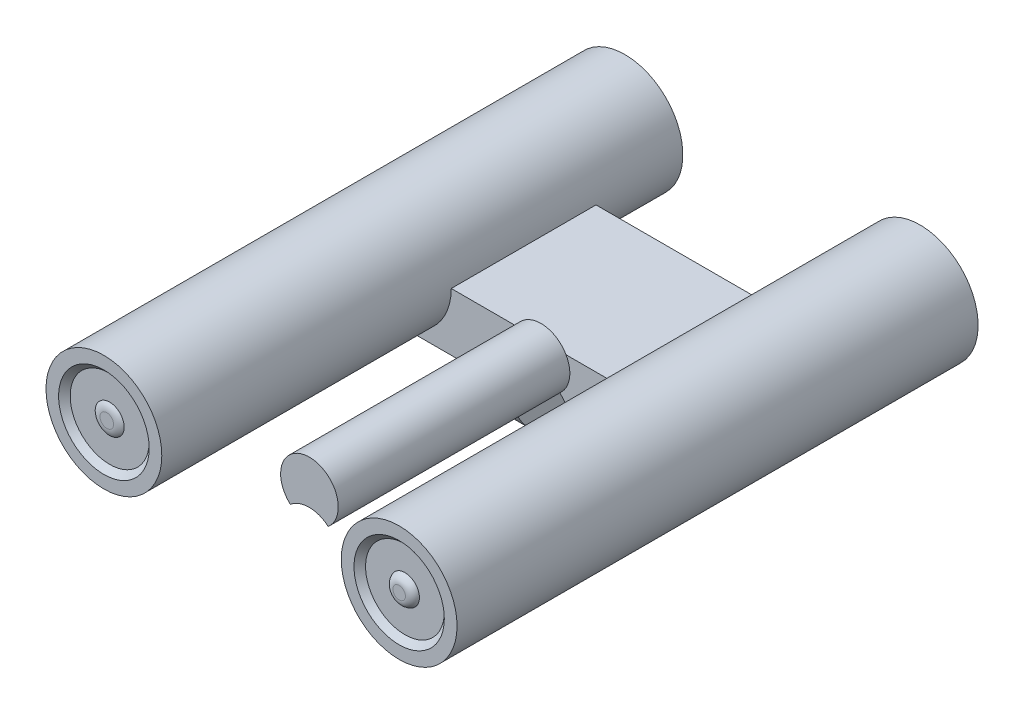
ISO-10303-21;
HEADER;
FILE_DESCRIPTION(('STEP AP214'),'2;1');
FILE_NAME('part.step','',(''),(''),'','','');
FILE_SCHEMA(('AUTOMOTIVE_DESIGN { 1 0 10303 214 1 1 1 1 }'));
ENDSEC;
DATA;
#1=APPLICATION_CONTEXT('core data for automotive mechanical design processes');
#2=APPLICATION_PROTOCOL_DEFINITION('international standard','automotive_design',2000,#1);
#3=PRODUCT_CONTEXT('',#1,'mechanical');
#4=PRODUCT('Part','Part','',(#3));
#5=PRODUCT_RELATED_PRODUCT_CATEGORY('part','',(#4));
#6=PRODUCT_DEFINITION_FORMATION('','',#4);
#7=PRODUCT_DEFINITION_CONTEXT('part definition',#1,'design');
#8=PRODUCT_DEFINITION('design','',#6,#7);
#9=PRODUCT_DEFINITION_SHAPE('','',#8);
#10=(LENGTH_UNIT() NAMED_UNIT(*) SI_UNIT(.MILLI.,.METRE.));
#11=(NAMED_UNIT(*) PLANE_ANGLE_UNIT() SI_UNIT($,.RADIAN.));
#12=(NAMED_UNIT(*) SI_UNIT($,.STERADIAN.) SOLID_ANGLE_UNIT());
#13=UNCERTAINTY_MEASURE_WITH_UNIT(LENGTH_MEASURE(1.E-05),#10,'distance_accuracy_value','');
#14=(GEOMETRIC_REPRESENTATION_CONTEXT(3) GLOBAL_UNCERTAINTY_ASSIGNED_CONTEXT((#13)) GLOBAL_UNIT_ASSIGNED_CONTEXT((#10,
#11,#12)) REPRESENTATION_CONTEXT('',''));
#15=CARTESIAN_POINT('',(0.,0.,0.));
#16=DIRECTION('',(0.,0.,1.));
#17=DIRECTION('',(1.,0.,0.));
#18=AXIS2_PLACEMENT_3D('',#15,#16,#17);
#19=CARTESIAN_POINT('',(51.,20.0045412051342,50.));
#20=DIRECTION('',(0.,0.,1.));
#21=DIRECTION('',(1.,0.,0.));
#22=AXIS2_PLACEMENT_3D('',#19,#20,#21);
#23=PLANE('',#22);
#24=CARTESIAN_POINT('',(-0.0878342514773877,0.00454120513421197,50.));
#25=DIRECTION('',(0.,0.,1.));
#26=DIRECTION('',(1.,0.,0.));
#27=AXIS2_PLACEMENT_3D('',#24,#25,#26);
#28=CIRCLE('',#27,10.);
#29=CARTESIAN_POINT('',(9.91216574852261,0.00454120513421197,50.));
#30=VERTEX_POINT('',#29);
#31=CARTESIAN_POINT('',(6.48452372863808,7.5413913815151,50.));
#32=VERTEX_POINT('',#31);
#33=EDGE_CURVE('E180',#30,#32,#28,.T.);
#34=ORIENTED_EDGE('',*,*,#33,.F.);
#35=DIRECTION('',(1.,0.,0.));
#36=VECTOR('',#35,1.);
#37=CARTESIAN_POINT('',(24.9121657485226,0.00454120513420759,50.));
#38=LINE('',#37,#36);
#39=CARTESIAN_POINT('',(24.9121657485226,0.00454120513422585,50.));
#40=VERTEX_POINT('',#39);
#41=EDGE_CURVE('E408',#30,#40,#38,.T.);
#42=ORIENTED_EDGE('',*,*,#41,.T.);
#43=DIRECTION('',(1.,0.,0.));
#44=VECTOR('',#43,1.);
#45=CARTESIAN_POINT('',(24.9121657485226,0.00454120513422585,50.));
#46=LINE('',#45,#44);
#47=CARTESIAN_POINT('',(51.,0.00454120513422585,50.));
#48=VERTEX_POINT('',#47);
#49=EDGE_CURVE('E355',#40,#48,#46,.T.);
#50=ORIENTED_EDGE('',*,*,#49,.T.);
#51=CARTESIAN_POINT('',(51.,20.0045412051342,50.));
#52=DIRECTION('',(0.,0.,1.));
#53=DIRECTION('',(1.,0.,0.));
#54=AXIS2_PLACEMENT_3D('',#51,#52,#53);
#55=CIRCLE('',#54,20.);
#56=CARTESIAN_POINT('',(31.,20.0045412051342,50.));
#57=VERTEX_POINT('',#56);
#58=EDGE_CURVE('E318',#57,#48,#55,.T.);
#59=ORIENTED_EDGE('',*,*,#58,.F.);
#60=DIRECTION('',(-1.,0.,0.));
#61=VECTOR('',#60,1.);
#62=CARTESIAN_POINT('',(-31.,20.0045412051342,50.));
#63=LINE('',#62,#61);
#64=CARTESIAN_POINT('',(8.65904755474706,20.0045412051342,50.));
#65=VERTEX_POINT('',#64);
#66=EDGE_CURVE('E346',#57,#65,#63,.T.);
#67=ORIENTED_EDGE('',*,*,#66,.T.);
#68=CARTESIAN_POINT('',(0.,15.0940631682774,50.));
#69=DIRECTION('',(0.,0.,1.));
#70=DIRECTION('',(1.,0.,0.));
#71=AXIS2_PLACEMENT_3D('',#68,#69,#70);
#72=CIRCLE('',#71,9.95449140367426);
#73=EDGE_CURVE('E71',#32,#65,#72,.T.);
#74=ORIENTED_EDGE('',*,*,#73,.F.);
#75=EDGE_LOOP('',(#34,#42,#50,#59,#67,#74));
#76=FACE_BOUND('',#75,.T.);
#77=ADVANCED_FACE('F47',(#76),#23,.T.);
#78=CARTESIAN_POINT('',(51.,20.0045412051342,0.));
#79=DIRECTION('',(0.,0.,1.));
#80=DIRECTION('',(1.,0.,0.));
#81=AXIS2_PLACEMENT_3D('',#78,#79,#80);
#82=PLANE('',#81);
#83=DIRECTION('',(1.,0.,0.));
#84=VECTOR('',#83,1.);
#85=CARTESIAN_POINT('',(51.,0.00454120513420156,0.));
#86=LINE('',#85,#84);
#87=CARTESIAN_POINT('',(24.9121657485226,0.00454120513422585,0.));
#88=VERTEX_POINT('',#87);
#89=CARTESIAN_POINT('',(9.91216574852261,0.00454120513421197,0.));
#90=VERTEX_POINT('',#89);
#91=EDGE_CURVE('E177',#88,#90,#86,.F.);
#92=ORIENTED_EDGE('',*,*,#91,.T.);
#93=CARTESIAN_POINT('',(-0.0878342514773877,0.00454120513421197,0.));
#94=DIRECTION('',(0.,0.,1.));
#95=DIRECTION('',(1.,0.,0.));
#96=AXIS2_PLACEMENT_3D('',#93,#94,#95);
#97=CIRCLE('',#96,10.);
#98=CARTESIAN_POINT('',(-10.0878342514774,0.00454120513421197,0.));
#99=VERTEX_POINT('',#98);
#100=EDGE_CURVE('E158',#90,#99,#97,.T.);
#101=ORIENTED_EDGE('',*,*,#100,.T.);
#102=DIRECTION('',(1.,0.,0.));
#103=VECTOR('',#102,1.);
#104=CARTESIAN_POINT('',(51.,0.00454120513421544,0.));
#105=LINE('',#104,#103);
#106=CARTESIAN_POINT('',(-25.0878342514774,0.00454120513421197,0.));
#107=VERTEX_POINT('',#106);
#108=EDGE_CURVE('E173',#99,#107,#105,.F.);
#109=ORIENTED_EDGE('',*,*,#108,.T.);
#110=DIRECTION('',(1.,0.,0.));
#111=VECTOR('',#110,1.);
#112=CARTESIAN_POINT('',(-51.,0.00454120513421197,0.));
#113=LINE('',#112,#111);
#114=CARTESIAN_POINT('',(-51.,0.0045412051342085,0.));
#115=VERTEX_POINT('',#114);
#116=EDGE_CURVE('E362',#115,#107,#113,.T.);
#117=ORIENTED_EDGE('',*,*,#116,.F.);
#118=CARTESIAN_POINT('',(-51.,20.0045412051342,0.));
#119=DIRECTION('',(0.,0.,-1.));
#120=DIRECTION('',(-1.,0.,0.));
#121=AXIS2_PLACEMENT_3D('',#118,#119,#120);
#122=CIRCLE('',#121,20.);
#123=CARTESIAN_POINT('',(-31.,20.0045412051342,0.));
#124=VERTEX_POINT('',#123);
#125=EDGE_CURVE('E306',#124,#115,#122,.T.);
#126=ORIENTED_EDGE('',*,*,#125,.F.);
#127=DIRECTION('',(-1.,0.,0.));
#128=VECTOR('',#127,1.);
#129=CARTESIAN_POINT('',(-31.,20.0045412051342,0.));
#130=LINE('',#129,#128);
#131=CARTESIAN_POINT('',(31.,20.0045412051342,0.));
#132=VERTEX_POINT('',#131);
#133=EDGE_CURVE('E345',#132,#124,#130,.T.);
#134=ORIENTED_EDGE('',*,*,#133,.F.);
#135=CARTESIAN_POINT('',(51.,20.0045412051342,0.));
#136=DIRECTION('',(0.,0.,1.));
#137=DIRECTION('',(1.,0.,0.));
#138=AXIS2_PLACEMENT_3D('',#135,#136,#137);
#139=CIRCLE('',#138,20.);
#140=CARTESIAN_POINT('',(51.,0.00454120513423278,0.));
#141=VERTEX_POINT('',#140);
#142=EDGE_CURVE('E227',#141,#132,#139,.F.);
#143=ORIENTED_EDGE('',*,*,#142,.F.);
#144=DIRECTION('',(1.,0.,0.));
#145=VECTOR('',#144,1.);
#146=CARTESIAN_POINT('',(24.9121657485226,0.00454120513422585,0.));
#147=LINE('',#146,#145);
#148=EDGE_CURVE('E365',#88,#141,#147,.T.);
#149=ORIENTED_EDGE('',*,*,#148,.F.);
#150=EDGE_LOOP('',(#92,#101,#109,#117,#126,#134,#143,#149));
#151=FACE_BOUND('',#150,.T.);
#152=ADVANCED_FACE('F170',(#151),#82,.F.);
#153=CARTESIAN_POINT('',(-6.57200768641268,7.61739184505086,50.));
#154=VERTEX_POINT('',#153);
#155=CARTESIAN_POINT('',(-10.0878342514774,0.00454120513421197,50.));
#156=VERTEX_POINT('',#155);
#157=EDGE_CURVE('E161',#154,#156,#28,.T.);
#158=ORIENTED_EDGE('',*,*,#157,.F.);
#159=CARTESIAN_POINT('',(-8.65904755474706,20.0045412051342,50.));
#160=VERTEX_POINT('',#159);
#161=EDGE_CURVE('E286',#160,#154,#72,.T.);
#162=ORIENTED_EDGE('',*,*,#161,.F.);
#163=CARTESIAN_POINT('',(-31.,20.0045412051342,50.));
#164=VERTEX_POINT('',#163);
#165=EDGE_CURVE('E352',#160,#164,#63,.T.);
#166=ORIENTED_EDGE('',*,*,#165,.T.);
#167=CARTESIAN_POINT('',(-51.,20.0045412051342,50.));
#168=DIRECTION('',(0.,0.,1.));
#169=DIRECTION('',(1.,0.,0.));
#170=AXIS2_PLACEMENT_3D('',#167,#168,#169);
#171=CIRCLE('',#170,20.);
#172=CARTESIAN_POINT('',(-51.,0.00454120513420156,50.));
#173=VERTEX_POINT('',#172);
#174=EDGE_CURVE('E223',#164,#173,#171,.F.);
#175=ORIENTED_EDGE('',*,*,#174,.T.);
#176=DIRECTION('',(1.,0.,0.));
#177=VECTOR('',#176,1.);
#178=CARTESIAN_POINT('',(-51.,0.00454120513421197,50.));
#179=LINE('',#178,#177);
#180=CARTESIAN_POINT('',(-25.0878342514774,0.00454120513421197,50.));
#181=VERTEX_POINT('',#180);
#182=EDGE_CURVE('E350',#173,#181,#179,.T.);
#183=ORIENTED_EDGE('',*,*,#182,.T.);
#184=DIRECTION('',(1.,0.,0.));
#185=VECTOR('',#184,1.);
#186=CARTESIAN_POINT('',(-10.0878342514774,0.00454120513421544,50.));
#187=LINE('',#186,#185);
#188=EDGE_CURVE('E191',#181,#156,#187,.T.);
#189=ORIENTED_EDGE('',*,*,#188,.T.);
#190=EDGE_LOOP('',(#158,#162,#166,#175,#183,#189));
#191=FACE_BOUND('',#190,.T.);
#192=ADVANCED_FACE('F267',(#191),#23,.T.);
#193=CARTESIAN_POINT('',(51.,20.0045412051342,50.));
#194=DIRECTION('',(0.,0.,-1.));
#195=DIRECTION('',(-1.,0.,0.));
#196=AXIS2_PLACEMENT_3D('',#193,#194,#195);
#197=CYLINDRICAL_SURFACE('',#196,20.);
#198=DIRECTION('',(0.,0.,-1.));
#199=VECTOR('',#198,1.);
#200=CARTESIAN_POINT('',(51.,0.00454120513422585,50.));
#201=LINE('',#200,#199);
#202=EDGE_CURVE('E358',#48,#141,#201,.T.);
#203=ORIENTED_EDGE('',*,*,#202,.T.);
#204=ORIENTED_EDGE('',*,*,#142,.T.);
#205=DIRECTION('',(0.,0.,-1.));
#206=VECTOR('',#205,1.);
#207=CARTESIAN_POINT('',(31.,20.0045412051342,50.));
#208=LINE('',#207,#206);
#209=EDGE_CURVE('E404',#57,#132,#208,.T.);
#210=ORIENTED_EDGE('',*,*,#209,.F.);
#211=ORIENTED_EDGE('',*,*,#58,.T.);
#212=EDGE_LOOP('',(#203,#204,#210,#211));
#213=FACE_BOUND('',#212,.T.);
#214=CARTESIAN_POINT('',(51.,20.0045412051342,150.));
#215=DIRECTION('',(0.,0.,1.));
#216=DIRECTION('',(1.,0.,0.));
#217=AXIS2_PLACEMENT_3D('',#214,#215,#216);
#218=CIRCLE('',#217,20.);
#219=CARTESIAN_POINT('',(71.,20.0045412051342,150.));
#220=VERTEX_POINT('',#219);
#221=EDGE_CURVE('E317',#220,#220,#218,.T.);
#222=ORIENTED_EDGE('',*,*,#221,.F.);
#223=EDGE_LOOP('',(#222));
#224=FACE_BOUND('',#223,.T.);
#225=CARTESIAN_POINT('',(51.,20.0045412051342,-30.));
#226=DIRECTION('',(0.,0.,-1.));
#227=DIRECTION('',(-1.,0.,0.));
#228=AXIS2_PLACEMENT_3D('',#225,#226,#227);
#229=CIRCLE('',#228,20.);
#230=CARTESIAN_POINT('',(31.,20.0045412051342,-30.));
#231=VERTEX_POINT('',#230);
#232=EDGE_CURVE('E309',#231,#231,#229,.T.);
#233=ORIENTED_EDGE('',*,*,#232,.F.);
#234=EDGE_LOOP('',(#233));
#235=FACE_BOUND('',#234,.T.);
#236=ADVANCED_FACE('F275',(#213,#224,#235),#197,.T.);
#237=CARTESIAN_POINT('',(-31.,20.0045412051342,50.));
#238=DIRECTION('',(0.,-1.,0.));
#239=DIRECTION('',(1.,0.,0.));
#240=AXIS2_PLACEMENT_3D('',#237,#238,#239);
#241=PLANE('',#240);
#242=ORIENTED_EDGE('',*,*,#133,.T.);
#243=DIRECTION('',(0.,0.,-1.));
#244=VECTOR('',#243,1.);
#245=CARTESIAN_POINT('',(-31.,20.0045412051342,50.));
#246=LINE('',#245,#244);
#247=EDGE_CURVE('E400',#164,#124,#246,.T.);
#248=ORIENTED_EDGE('',*,*,#247,.F.);
#249=ORIENTED_EDGE('',*,*,#165,.F.);
#250=EDGE_CURVE('E351',#65,#160,#63,.T.);
#251=ORIENTED_EDGE('',*,*,#250,.F.);
#252=ORIENTED_EDGE('',*,*,#66,.F.);
#253=ORIENTED_EDGE('',*,*,#209,.T.);
#254=EDGE_LOOP('',(#242,#248,#249,#251,#252,#253));
#255=FACE_BOUND('',#254,.T.);
#256=ADVANCED_FACE('F280',(#255),#241,.F.);
#257=CARTESIAN_POINT('',(-51.,20.0045412051342,50.));
#258=DIRECTION('',(0.,0.,-1.));
#259=DIRECTION('',(-1.,0.,0.));
#260=AXIS2_PLACEMENT_3D('',#257,#258,#259);
#261=CYLINDRICAL_SURFACE('',#260,20.);
#262=ORIENTED_EDGE('',*,*,#247,.T.);
#263=ORIENTED_EDGE('',*,*,#125,.T.);
#264=DIRECTION('',(0.,0.,-1.));
#265=VECTOR('',#264,1.);
#266=CARTESIAN_POINT('',(-51.,0.0045412051342085,50.));
#267=LINE('',#266,#265);
#268=EDGE_CURVE('E396',#173,#115,#267,.T.);
#269=ORIENTED_EDGE('',*,*,#268,.F.);
#270=ORIENTED_EDGE('',*,*,#174,.F.);
#271=EDGE_LOOP('',(#262,#263,#269,#270));
#272=FACE_BOUND('',#271,.T.);
#273=CARTESIAN_POINT('',(-51.,20.0045412051342,150.));
#274=DIRECTION('',(0.,0.,1.));
#275=DIRECTION('',(1.,0.,0.));
#276=AXIS2_PLACEMENT_3D('',#273,#274,#275);
#277=CIRCLE('',#276,20.);
#278=CARTESIAN_POINT('',(-31.,20.0045412051342,150.));
#279=VERTEX_POINT('',#278);
#280=EDGE_CURVE('E322',#279,#279,#277,.T.);
#281=ORIENTED_EDGE('',*,*,#280,.F.);
#282=EDGE_LOOP('',(#281));
#283=FACE_BOUND('',#282,.T.);
#284=CARTESIAN_POINT('',(-51.,20.0045412051342,-30.));
#285=DIRECTION('',(0.,0.,-1.));
#286=DIRECTION('',(-1.,0.,0.));
#287=AXIS2_PLACEMENT_3D('',#284,#285,#286);
#288=CIRCLE('',#287,20.);
#289=CARTESIAN_POINT('',(-71.,20.0045412051342,-30.));
#290=VERTEX_POINT('',#289);
#291=EDGE_CURVE('E310',#290,#290,#288,.T.);
#292=ORIENTED_EDGE('',*,*,#291,.F.);
#293=EDGE_LOOP('',(#292));
#294=FACE_BOUND('',#293,.T.);
#295=ADVANCED_FACE('F453',(#272,#283,#294),#261,.T.);
#296=CARTESIAN_POINT('',(-51.,0.00454120513421197,50.));
#297=DIRECTION('',(0.,1.,0.));
#298=DIRECTION('',(0.,0.,1.));
#299=AXIS2_PLACEMENT_3D('',#296,#297,#298);
#300=PLANE('',#299);
#301=ORIENTED_EDGE('',*,*,#116,.T.);
#302=DIRECTION('',(0.,0.,-1.));
#303=VECTOR('',#302,1.);
#304=CARTESIAN_POINT('',(-25.0878342514774,0.00454120513421197,50.));
#305=LINE('',#304,#303);
#306=EDGE_CURVE('E392',#181,#107,#305,.T.);
#307=ORIENTED_EDGE('',*,*,#306,.F.);
#308=ORIENTED_EDGE('',*,*,#182,.F.);
#309=ORIENTED_EDGE('',*,*,#268,.T.);
#310=EDGE_LOOP('',(#301,#307,#308,#309));
#311=FACE_BOUND('',#310,.T.);
#312=ADVANCED_FACE('F434',(#311),#300,.F.);
#313=CARTESIAN_POINT('',(-25.0878342514774,-19.9954587948658,50.));
#314=DIRECTION('',(1.,0.,0.));
#315=DIRECTION('',(0.,0.,-1.));
#316=AXIS2_PLACEMENT_3D('',#313,#314,#315);
#317=PLANE('',#316);
#318=CARTESIAN_POINT('',(-25.0878342514774,-9.99545879486579,25.));
#319=DIRECTION('',(1.,0.,0.));
#320=DIRECTION('',(0.,0.,-1.));
#321=AXIS2_PLACEMENT_3D('',#318,#319,#320);
#322=CIRCLE('',#321,5.);
#323=CARTESIAN_POINT('',(-25.0878342514774,-9.99545879486579,20.));
#324=VERTEX_POINT('',#323);
#325=EDGE_CURVE('E341',#324,#324,#322,.T.);
#326=ORIENTED_EDGE('',*,*,#325,.T.);
#327=EDGE_LOOP('',(#326));
#328=FACE_BOUND('',#327,.T.);
#329=DIRECTION('',(0.,0.,-1.));
#330=VECTOR('',#329,1.);
#331=CARTESIAN_POINT('',(-25.0878342514774,-19.9954587948658,50.));
#332=LINE('',#331,#330);
#333=CARTESIAN_POINT('',(-25.0878342514774,-19.9954587948658,30.));
#334=VERTEX_POINT('',#333);
#335=CARTESIAN_POINT('',(-25.0878342514774,-19.9954587948658,20.));
#336=VERTEX_POINT('',#335);
#337=EDGE_CURVE('E388',#334,#336,#332,.T.);
#338=ORIENTED_EDGE('',*,*,#337,.F.);
#339=CARTESIAN_POINT('',(-25.0878342514774,0.00454120513421544,30.));
#340=DIRECTION('',(1.,0.,0.));
#341=DIRECTION('',(0.,0.,-1.));
#342=AXIS2_PLACEMENT_3D('',#339,#340,#341);
#343=CIRCLE('',#342,20.);
#344=EDGE_CURVE('E203',#334,#181,#343,.F.);
#345=ORIENTED_EDGE('',*,*,#344,.T.);
#346=ORIENTED_EDGE('',*,*,#306,.T.);
#347=CARTESIAN_POINT('',(-25.0878342514774,0.00454120513421544,20.));
#348=DIRECTION('',(1.,0.,0.));
#349=DIRECTION('',(0.,0.,-1.));
#350=AXIS2_PLACEMENT_3D('',#347,#348,#349);
#351=CIRCLE('',#350,20.);
#352=EDGE_CURVE('E195',#107,#336,#351,.F.);
#353=ORIENTED_EDGE('',*,*,#352,.T.);
#354=EDGE_LOOP('',(#338,#345,#346,#353));
#355=FACE_BOUND('',#354,.T.);
#356=ADVANCED_FACE('F427',(#328,#355),#317,.F.);
#357=CARTESIAN_POINT('',(-25.0878342514774,-19.9954587948658,50.));
#358=DIRECTION('',(0.,1.,0.));
#359=DIRECTION('',(0.,0.,1.));
#360=AXIS2_PLACEMENT_3D('',#357,#358,#359);
#361=PLANE('',#360);
#362=DIRECTION('',(0.,0.,-1.));
#363=VECTOR('',#362,1.);
#364=CARTESIAN_POINT('',(-10.0878342514774,-19.9954587948658,50.));
#365=LINE('',#364,#363);
#366=CARTESIAN_POINT('',(-10.0878342514774,-19.9954587948658,30.));
#367=VERTEX_POINT('',#366);
#368=CARTESIAN_POINT('',(-10.0878342514774,-19.9954587948658,20.));
#369=VERTEX_POINT('',#368);
#370=EDGE_CURVE('E166',#367,#369,#365,.T.);
#371=ORIENTED_EDGE('',*,*,#370,.F.);
#372=DIRECTION('',(1.,0.,0.));
#373=VECTOR('',#372,1.);
#374=CARTESIAN_POINT('',(-25.0878342514774,-19.9954587948658,30.));
#375=LINE('',#374,#373);
#376=EDGE_CURVE('E419',#367,#334,#375,.F.);
#377=ORIENTED_EDGE('',*,*,#376,.T.);
#378=ORIENTED_EDGE('',*,*,#337,.T.);
#379=DIRECTION('',(1.,0.,0.));
#380=VECTOR('',#379,1.);
#381=CARTESIAN_POINT('',(-25.0878342514774,-19.9954587948658,20.));
#382=LINE('',#381,#380);
#383=EDGE_CURVE('E416',#336,#369,#382,.T.);
#384=ORIENTED_EDGE('',*,*,#383,.T.);
#385=EDGE_LOOP('',(#371,#377,#378,#384));
#386=FACE_BOUND('',#385,.T.);
#387=ADVANCED_FACE('F437',(#386),#361,.F.);
#388=CARTESIAN_POINT('',(-10.0878342514774,-19.9954587948658,50.));
#389=DIRECTION('',(-1.,0.,0.));
#390=DIRECTION('',(0.,0.,1.));
#391=AXIS2_PLACEMENT_3D('',#388,#389,#390);
#392=PLANE('',#391);
#393=CARTESIAN_POINT('',(-10.0878342514774,-9.99545879486579,25.));
#394=DIRECTION('',(-1.,0.,0.));
#395=DIRECTION('',(0.,0.,1.));
#396=AXIS2_PLACEMENT_3D('',#393,#394,#395);
#397=CIRCLE('',#396,5.);
#398=CARTESIAN_POINT('',(-10.0878342514774,-9.99545879486579,30.));
#399=VERTEX_POINT('',#398);
#400=EDGE_CURVE('E337',#399,#399,#397,.T.);
#401=ORIENTED_EDGE('',*,*,#400,.T.);
#402=EDGE_LOOP('',(#401));
#403=FACE_BOUND('',#402,.T.);
#404=DIRECTION('',(0.,0.,-1.));
#405=VECTOR('',#404,1.);
#406=CARTESIAN_POINT('',(-10.0878342514774,0.00454120513421544,50.));
#407=LINE('',#406,#405);
#408=EDGE_CURVE('E155',#156,#99,#407,.T.);
#409=ORIENTED_EDGE('',*,*,#408,.F.);
#410=CARTESIAN_POINT('',(-10.0878342514774,0.00454120513421544,30.));
#411=DIRECTION('',(-1.,0.,0.));
#412=DIRECTION('',(0.,0.,1.));
#413=AXIS2_PLACEMENT_3D('',#410,#411,#412);
#414=CIRCLE('',#413,20.);
#415=EDGE_CURVE('E190',#156,#367,#414,.F.);
#416=ORIENTED_EDGE('',*,*,#415,.T.);
#417=ORIENTED_EDGE('',*,*,#370,.T.);
#418=CARTESIAN_POINT('',(-10.0878342514774,0.00454120513421544,20.));
#419=DIRECTION('',(-1.,0.,0.));
#420=DIRECTION('',(0.,0.,1.));
#421=AXIS2_PLACEMENT_3D('',#418,#419,#420);
#422=CIRCLE('',#421,20.);
#423=EDGE_CURVE('E183',#369,#99,#422,.F.);
#424=ORIENTED_EDGE('',*,*,#423,.T.);
#425=EDGE_LOOP('',(#409,#416,#417,#424));
#426=FACE_BOUND('',#425,.T.);
#427=ADVANCED_FACE('F184',(#403,#426),#392,.F.);
#428=CARTESIAN_POINT('',(9.91216574852261,0.00454120513421544,50.));
#429=DIRECTION('',(1.,0.,0.));
#430=DIRECTION('',(0.,1.,0.));
#431=AXIS2_PLACEMENT_3D('',#428,#429,#430);
#432=PLANE('',#431);
#433=CARTESIAN_POINT('',(9.91216574852261,-9.99545879486579,25.));
#434=DIRECTION('',(1.,0.,0.));
#435=DIRECTION('',(0.,1.,0.));
#436=AXIS2_PLACEMENT_3D('',#433,#434,#435);
#437=CIRCLE('',#436,5.);
#438=CARTESIAN_POINT('',(9.91216574852261,-4.99545879486579,25.));
#439=VERTEX_POINT('',#438);
#440=EDGE_CURVE('E333',#439,#439,#437,.T.);
#441=ORIENTED_EDGE('',*,*,#440,.T.);
#442=EDGE_LOOP('',(#441));
#443=FACE_BOUND('',#442,.T.);
#444=DIRECTION('',(0.,0.,-1.));
#445=VECTOR('',#444,1.);
#446=CARTESIAN_POINT('',(9.91216574852261,0.00454120513421544,50.));
#447=LINE('',#446,#445);
#448=EDGE_CURVE('E167',#30,#90,#447,.T.);
#449=ORIENTED_EDGE('',*,*,#448,.T.);
#450=CARTESIAN_POINT('',(9.91216574852261,0.00454120513421197,20.));
#451=DIRECTION('',(1.,0.,0.));
#452=DIRECTION('',(0.,1.,0.));
#453=AXIS2_PLACEMENT_3D('',#450,#451,#452);
#454=CIRCLE('',#453,20.);
#455=CARTESIAN_POINT('',(9.91216574852261,-19.9954587948658,20.));
#456=VERTEX_POINT('',#455);
#457=EDGE_CURVE('E220',#90,#456,#454,.F.);
#458=ORIENTED_EDGE('',*,*,#457,.T.);
#459=DIRECTION('',(0.,0.,-1.));
#460=VECTOR('',#459,1.);
#461=CARTESIAN_POINT('',(9.91216574852261,-19.9954587948658,50.));
#462=LINE('',#461,#460);
#463=CARTESIAN_POINT('',(9.91216574852261,-19.9954587948658,30.));
#464=VERTEX_POINT('',#463);
#465=EDGE_CURVE('E380',#464,#456,#462,.T.);
#466=ORIENTED_EDGE('',*,*,#465,.F.);
#467=CARTESIAN_POINT('',(9.91216574852261,0.00454120513421106,30.));
#468=DIRECTION('',(1.,0.,0.));
#469=DIRECTION('',(0.,1.,0.));
#470=AXIS2_PLACEMENT_3D('',#467,#468,#469);
#471=CIRCLE('',#470,20.);
#472=EDGE_CURVE('E216',#464,#30,#471,.F.);
#473=ORIENTED_EDGE('',*,*,#472,.T.);
#474=EDGE_LOOP('',(#449,#458,#466,#473));
#475=FACE_BOUND('',#474,.T.);
#476=ADVANCED_FACE('F444',(#443,#475),#432,.F.);
#477=CARTESIAN_POINT('',(9.91216574852261,-19.9954587948658,50.));
#478=DIRECTION('',(0.,1.,0.));
#479=DIRECTION('',(-1.,0.,0.));
#480=AXIS2_PLACEMENT_3D('',#477,#478,#479);
#481=PLANE('',#480);
#482=ORIENTED_EDGE('',*,*,#465,.T.);
#483=DIRECTION('',(1.,0.,0.));
#484=VECTOR('',#483,1.);
#485=CARTESIAN_POINT('',(9.91216574852261,-19.9954587948658,20.));
#486=LINE('',#485,#484);
#487=CARTESIAN_POINT('',(24.9121657485226,-19.9954587948658,20.));
#488=VERTEX_POINT('',#487);
#489=EDGE_CURVE('E201',#456,#488,#486,.T.);
#490=ORIENTED_EDGE('',*,*,#489,.T.);
#491=DIRECTION('',(0.,0.,-1.));
#492=VECTOR('',#491,1.);
#493=CARTESIAN_POINT('',(24.9121657485226,-19.9954587948658,50.));
#494=LINE('',#493,#492);
#495=CARTESIAN_POINT('',(24.9121657485226,-19.9954587948658,30.));
#496=VERTEX_POINT('',#495);
#497=EDGE_CURVE('E376',#496,#488,#494,.T.);
#498=ORIENTED_EDGE('',*,*,#497,.F.);
#499=DIRECTION('',(1.,0.,0.));
#500=VECTOR('',#499,1.);
#501=CARTESIAN_POINT('',(9.91216574852261,-19.9954587948658,30.));
#502=LINE('',#501,#500);
#503=EDGE_CURVE('E197',#496,#464,#502,.F.);
#504=ORIENTED_EDGE('',*,*,#503,.T.);
#505=EDGE_LOOP('',(#482,#490,#498,#504));
#506=FACE_BOUND('',#505,.T.);
#507=ADVANCED_FACE('F526',(#506),#481,.F.);
#508=CARTESIAN_POINT('',(24.9121657485226,-19.9954587948658,50.));
#509=DIRECTION('',(-1.,0.,0.));
#510=DIRECTION('',(0.,0.,1.));
#511=AXIS2_PLACEMENT_3D('',#508,#509,#510);
#512=PLANE('',#511);
#513=CARTESIAN_POINT('',(24.9121657485226,-9.99545879486579,25.));
#514=DIRECTION('',(1.,0.,0.));
#515=DIRECTION('',(0.,0.,-1.));
#516=AXIS2_PLACEMENT_3D('',#513,#514,#515);
#517=CIRCLE('',#516,5.);
#518=CARTESIAN_POINT('',(24.9121657485226,-9.99545879486579,20.));
#519=VERTEX_POINT('',#518);
#520=EDGE_CURVE('E329',#519,#519,#517,.T.);
#521=ORIENTED_EDGE('',*,*,#520,.F.);
#522=EDGE_LOOP('',(#521));
#523=FACE_BOUND('',#522,.T.);
#524=ORIENTED_EDGE('',*,*,#497,.T.);
#525=CARTESIAN_POINT('',(24.9121657485226,0.0045412051342085,20.));
#526=DIRECTION('',(-1.,0.,0.));
#527=DIRECTION('',(0.,0.,1.));
#528=AXIS2_PLACEMENT_3D('',#525,#526,#527);
#529=CIRCLE('',#528,20.);
#530=EDGE_CURVE('E213',#488,#88,#529,.F.);
#531=ORIENTED_EDGE('',*,*,#530,.T.);
#532=DIRECTION('',(0.,0.,-1.));
#533=VECTOR('',#532,1.);
#534=CARTESIAN_POINT('',(24.9121657485226,0.00454120513422585,50.));
#535=LINE('',#534,#533);
#536=EDGE_CURVE('E372',#40,#88,#535,.T.);
#537=ORIENTED_EDGE('',*,*,#536,.F.);
#538=CARTESIAN_POINT('',(24.9121657485226,0.00454120513420759,30.));
#539=DIRECTION('',(-1.,0.,0.));
#540=DIRECTION('',(0.,0.,1.));
#541=AXIS2_PLACEMENT_3D('',#538,#539,#540);
#542=CIRCLE('',#541,20.);
#543=EDGE_CURVE('E210',#40,#496,#542,.F.);
#544=ORIENTED_EDGE('',*,*,#543,.T.);
#545=EDGE_LOOP('',(#524,#531,#537,#544));
#546=FACE_BOUND('',#545,.T.);
#547=ADVANCED_FACE('F531',(#523,#546),#512,.F.);
#548=CARTESIAN_POINT('',(24.9121657485226,0.00454120513422585,50.));
#549=DIRECTION('',(0.,1.,0.));
#550=DIRECTION('',(0.,0.,1.));
#551=AXIS2_PLACEMENT_3D('',#548,#549,#550);
#552=PLANE('',#551);
#553=ORIENTED_EDGE('',*,*,#148,.T.);
#554=ORIENTED_EDGE('',*,*,#202,.F.);
#555=ORIENTED_EDGE('',*,*,#49,.F.);
#556=ORIENTED_EDGE('',*,*,#536,.T.);
#557=EDGE_LOOP('',(#553,#554,#555,#556));
#558=FACE_BOUND('',#557,.T.);
#559=ADVANCED_FACE('F518',(#558),#552,.F.);
#560=CARTESIAN_POINT('',(-71.,-9.99545879486579,25.));
#561=DIRECTION('',(1.,0.,0.));
#562=DIRECTION('',(0.,0.,-1.));
#563=AXIS2_PLACEMENT_3D('',#560,#561,#562);
#564=CYLINDRICAL_SURFACE('',#563,5.);
#565=ORIENTED_EDGE('',*,*,#520,.T.);
#566=EDGE_LOOP('',(#565));
#567=FACE_BOUND('',#566,.T.);
#568=ORIENTED_EDGE('',*,*,#440,.F.);
#569=EDGE_LOOP('',(#568));
#570=FACE_BOUND('',#569,.T.);
#571=ADVANCED_FACE('F539',(#567,#570),#564,.F.);
#572=ORIENTED_EDGE('',*,*,#400,.F.);
#573=EDGE_LOOP('',(#572));
#574=FACE_BOUND('',#573,.T.);
#575=ORIENTED_EDGE('',*,*,#325,.F.);
#576=EDGE_LOOP('',(#575));
#577=FACE_BOUND('',#576,.T.);
#578=ADVANCED_FACE('F462',(#574,#577),#564,.F.);
#579=CARTESIAN_POINT('',(51.,0.00454120513421544,30.));
#580=DIRECTION('',(-1.,0.,0.));
#581=DIRECTION('',(0.,0.,1.));
#582=AXIS2_PLACEMENT_3D('',#579,#580,#581);
#583=CYLINDRICAL_SURFACE('',#582,20.);
#584=ORIENTED_EDGE('',*,*,#344,.F.);
#585=ORIENTED_EDGE('',*,*,#376,.F.);
#586=ORIENTED_EDGE('',*,*,#415,.F.);
#587=ORIENTED_EDGE('',*,*,#188,.F.);
#588=EDGE_LOOP('',(#584,#585,#586,#587));
#589=FACE_BOUND('',#588,.T.);
#590=ADVANCED_FACE('F435',(#589),#583,.T.);
#591=CARTESIAN_POINT('',(-25.0878342514774,0.00454120513421544,20.));
#592=DIRECTION('',(1.,0.,0.));
#593=DIRECTION('',(0.,0.,-1.));
#594=AXIS2_PLACEMENT_3D('',#591,#592,#593);
#595=CYLINDRICAL_SURFACE('',#594,20.);
#596=ORIENTED_EDGE('',*,*,#352,.F.);
#597=ORIENTED_EDGE('',*,*,#108,.F.);
#598=ORIENTED_EDGE('',*,*,#423,.F.);
#599=ORIENTED_EDGE('',*,*,#383,.F.);
#600=EDGE_LOOP('',(#596,#597,#598,#599));
#601=FACE_BOUND('',#600,.T.);
#602=ADVANCED_FACE('F194',(#601),#595,.T.);
#603=CARTESIAN_POINT('',(9.91216574852262,0.00454120513421197,20.));
#604=DIRECTION('',(1.,0.,0.));
#605=DIRECTION('',(0.,1.,0.));
#606=AXIS2_PLACEMENT_3D('',#603,#604,#605);
#607=CYLINDRICAL_SURFACE('',#606,20.);
#608=ORIENTED_EDGE('',*,*,#457,.F.);
#609=ORIENTED_EDGE('',*,*,#91,.F.);
#610=ORIENTED_EDGE('',*,*,#530,.F.);
#611=ORIENTED_EDGE('',*,*,#489,.F.);
#612=EDGE_LOOP('',(#608,#609,#610,#611));
#613=FACE_BOUND('',#612,.T.);
#614=ADVANCED_FACE('F465',(#613),#607,.T.);
#615=CARTESIAN_POINT('',(51.,0.00454120513420156,30.));
#616=DIRECTION('',(-1.,0.,0.));
#617=DIRECTION('',(0.,-1.,0.));
#618=AXIS2_PLACEMENT_3D('',#615,#616,#617);
#619=CYLINDRICAL_SURFACE('',#618,20.);
#620=ORIENTED_EDGE('',*,*,#472,.F.);
#621=ORIENTED_EDGE('',*,*,#503,.F.);
#622=ORIENTED_EDGE('',*,*,#543,.F.);
#623=ORIENTED_EDGE('',*,*,#41,.F.);
#624=EDGE_LOOP('',(#620,#621,#622,#623));
#625=FACE_BOUND('',#624,.T.);
#626=ADVANCED_FACE('F468',(#625),#619,.T.);
#627=CARTESIAN_POINT('',(-51.,20.0045412051342,150.));
#628=DIRECTION('',(0.,0.,1.));
#629=DIRECTION('',(1.,0.,0.));
#630=AXIS2_PLACEMENT_3D('',#627,#628,#629);
#631=PLANE('',#630);
#632=CARTESIAN_POINT('',(-51.,20.0045412051342,150.));
#633=DIRECTION('',(0.,0.,1.));
#634=DIRECTION('',(1.,0.,0.));
#635=AXIS2_PLACEMENT_3D('',#632,#633,#634);
#636=CIRCLE('',#635,15.6438362550542);
#637=CARTESIAN_POINT('',(-35.3561637449458,20.0045412051342,150.));
#638=VERTEX_POINT('',#637);
#639=EDGE_CURVE('E233',#638,#638,#636,.F.);
#640=ORIENTED_EDGE('',*,*,#639,.T.);
#641=EDGE_LOOP('',(#640));
#642=FACE_BOUND('',#641,.T.);
#643=ORIENTED_EDGE('',*,*,#280,.T.);
#644=EDGE_LOOP('',(#643));
#645=FACE_BOUND('',#644,.T.);
#646=ADVANCED_FACE('F472',(#642,#645),#631,.T.);
#647=CARTESIAN_POINT('',(51.,20.0045412051342,150.));
#648=DIRECTION('',(0.,0.,1.));
#649=DIRECTION('',(1.,0.,0.));
#650=AXIS2_PLACEMENT_3D('',#647,#648,#649);
#651=PLANE('',#650);
#652=CARTESIAN_POINT('',(51.,20.0045412051342,150.));
#653=DIRECTION('',(0.,0.,1.));
#654=DIRECTION('',(1.,0.,0.));
#655=AXIS2_PLACEMENT_3D('',#652,#653,#654);
#656=CIRCLE('',#655,15.6000000000001);
#657=CARTESIAN_POINT('',(66.6000000000001,20.0045412051342,150.));
#658=VERTEX_POINT('',#657);
#659=EDGE_CURVE('E11',#658,#658,#656,.F.);
#660=ORIENTED_EDGE('',*,*,#659,.T.);
#661=EDGE_LOOP('',(#660));
#662=FACE_BOUND('',#661,.T.);
#663=ORIENTED_EDGE('',*,*,#221,.T.);
#664=EDGE_LOOP('',(#663));
#665=FACE_BOUND('',#664,.T.);
#666=ADVANCED_FACE('F558',(#662,#665),#651,.T.);
#667=CARTESIAN_POINT('',(51.,20.0045412051342,-30.));
#668=DIRECTION('',(0.,0.,-1.));
#669=DIRECTION('',(-1.,0.,0.));
#670=AXIS2_PLACEMENT_3D('',#667,#668,#669);
#671=PLANE('',#670);
#672=ORIENTED_EDGE('',*,*,#232,.T.);
#673=EDGE_LOOP('',(#672));
#674=FACE_BOUND('',#673,.T.);
#675=ADVANCED_FACE('F562',(#674),#671,.T.);
#676=CARTESIAN_POINT('',(-51.,20.0045412051342,-30.));
#677=DIRECTION('',(0.,0.,-1.));
#678=DIRECTION('',(-1.,0.,0.));
#679=AXIS2_PLACEMENT_3D('',#676,#677,#678);
#680=PLANE('',#679);
#681=ORIENTED_EDGE('',*,*,#291,.T.);
#682=EDGE_LOOP('',(#681));
#683=FACE_BOUND('',#682,.T.);
#684=ADVANCED_FACE('F566',(#683),#680,.T.);
#685=CARTESIAN_POINT('',(0.,15.0940631682774,50.));
#686=DIRECTION('',(0.,0.,1.));
#687=DIRECTION('',(1.,0.,0.));
#688=AXIS2_PLACEMENT_3D('',#685,#686,#687);
#689=PLANE('',#688);
#690=EDGE_CURVE('E298',#65,#160,#72,.T.);
#691=ORIENTED_EDGE('',*,*,#690,.F.);
#692=ORIENTED_EDGE('',*,*,#250,.T.);
#693=EDGE_LOOP('',(#691,#692));
#694=FACE_BOUND('',#693,.T.);
#695=ADVANCED_FACE('F508',(#694),#689,.F.);
#696=CARTESIAN_POINT('',(0.,15.0940631682774,130.));
#697=DIRECTION('',(0.,0.,-1.));
#698=DIRECTION('',(-1.,0.,0.));
#699=AXIS2_PLACEMENT_3D('',#696,#697,#698);
#700=CYLINDRICAL_SURFACE('',#699,9.95449140367426);
#701=ORIENTED_EDGE('',*,*,#161,.T.);
#702=DIRECTION('',(0.,0.,1.));
#703=VECTOR('',#702,1.);
#704=CARTESIAN_POINT('',(-6.57200768641269,7.61739184505086,60.));
#705=LINE('',#704,#703);
#706=CARTESIAN_POINT('',(-6.57200768641269,7.61739184505086,130.));
#707=VERTEX_POINT('',#706);
#708=EDGE_CURVE('E291',#154,#707,#705,.T.);
#709=ORIENTED_EDGE('',*,*,#708,.T.);
#710=CARTESIAN_POINT('',(0.,15.0940631682774,130.));
#711=DIRECTION('',(0.,0.,1.));
#712=DIRECTION('',(1.,0.,0.));
#713=AXIS2_PLACEMENT_3D('',#710,#711,#712);
#714=CIRCLE('',#713,9.95449140367426);
#715=CARTESIAN_POINT('',(6.48452372863808,7.5413913815151,130.));
#716=VERTEX_POINT('',#715);
#717=EDGE_CURVE('E303',#716,#707,#714,.T.);
#718=ORIENTED_EDGE('',*,*,#717,.F.);
#719=DIRECTION('',(0.,0.,1.));
#720=VECTOR('',#719,1.);
#721=CARTESIAN_POINT('',(6.48452372863808,7.5413913815151,60.));
#722=LINE('',#721,#720);
#723=EDGE_CURVE('E64',#716,#32,#722,.F.);
#724=ORIENTED_EDGE('',*,*,#723,.T.);
#725=ORIENTED_EDGE('',*,*,#73,.T.);
#726=ORIENTED_EDGE('',*,*,#690,.T.);
#727=EDGE_LOOP('',(#701,#709,#718,#724,#725,#726));
#728=FACE_BOUND('',#727,.T.);
#729=ADVANCED_FACE('F294',(#728),#700,.T.);
#730=CARTESIAN_POINT('',(0.,15.0940631682774,130.));
#731=DIRECTION('',(0.,0.,1.));
#732=DIRECTION('',(1.,0.,0.));
#733=AXIS2_PLACEMENT_3D('',#730,#731,#732);
#734=PLANE('',#733);
#735=CARTESIAN_POINT('',(-0.0878342514773877,0.00454120513421197,130.));
#736=DIRECTION('',(0.,0.,1.));
#737=DIRECTION('',(1.,0.,0.));
#738=AXIS2_PLACEMENT_3D('',#735,#736,#737);
#739=CIRCLE('',#738,10.);
#740=EDGE_CURVE('E230',#716,#707,#739,.T.);
#741=ORIENTED_EDGE('',*,*,#740,.F.);
#742=ORIENTED_EDGE('',*,*,#717,.T.);
#743=EDGE_LOOP('',(#741,#742));
#744=FACE_BOUND('',#743,.T.);
#745=ADVANCED_FACE('F573',(#744),#734,.T.);
#746=CARTESIAN_POINT('',(-0.0878342514773877,0.00454120513421197,-30.));
#747=DIRECTION('',(0.,0.,1.));
#748=DIRECTION('',(1.,0.,0.));
#749=AXIS2_PLACEMENT_3D('',#746,#747,#748);
#750=CYLINDRICAL_SURFACE('',#749,10.);
#751=ORIENTED_EDGE('',*,*,#448,.F.);
#752=ORIENTED_EDGE('',*,*,#33,.T.);
#753=ORIENTED_EDGE('',*,*,#723,.F.);
#754=ORIENTED_EDGE('',*,*,#740,.T.);
#755=ORIENTED_EDGE('',*,*,#708,.F.);
#756=ORIENTED_EDGE('',*,*,#157,.T.);
#757=ORIENTED_EDGE('',*,*,#408,.T.);
#758=ORIENTED_EDGE('',*,*,#100,.F.);
#759=EDGE_LOOP('',(#751,#752,#753,#754,#755,#756,#757,#758));
#760=FACE_BOUND('',#759,.T.);
#761=ADVANCED_FACE('F157',(#760),#750,.F.);
#762=CARTESIAN_POINT('',(-51.,20.0045412051342,148.));
#763=DIRECTION('',(0.,0.,1.));
#764=DIRECTION('',(1.,0.,0.));
#765=AXIS2_PLACEMENT_3D('',#762,#763,#764);
#766=PLANE('',#765);
#767=CARTESIAN_POINT('',(-51.,20.0045412051342,148.));
#768=DIRECTION('',(0.,0.,1.));
#769=DIRECTION('',(1.,0.,0.));
#770=AXIS2_PLACEMENT_3D('',#767,#768,#769);
#771=CIRCLE('',#770,5.);
#772=CARTESIAN_POINT('',(-46.,20.0045412051342,148.));
#773=VERTEX_POINT('',#772);
#774=EDGE_CURVE('E234',#773,#773,#771,.F.);
#775=ORIENTED_EDGE('',*,*,#774,.T.);
#776=EDGE_LOOP('',(#775));
#777=FACE_BOUND('',#776,.T.);
#778=CARTESIAN_POINT('',(-51.,20.0045412051342,148.));
#779=DIRECTION('',(0.,0.,1.));
#780=DIRECTION('',(1.,0.,0.));
#781=AXIS2_PLACEMENT_3D('',#778,#779,#780);
#782=CIRCLE('',#781,13.6438362550542);
#783=CARTESIAN_POINT('',(-37.3561637449458,20.0045412051342,148.));
#784=VERTEX_POINT('',#783);
#785=EDGE_CURVE('E238',#784,#784,#782,.T.);
#786=ORIENTED_EDGE('',*,*,#785,.T.);
#787=EDGE_LOOP('',(#786));
#788=FACE_BOUND('',#787,.T.);
#789=ADVANCED_FACE('F488',(#777,#788),#766,.T.);
#790=CARTESIAN_POINT('',(-51.,20.0045412051342,149.));
#791=DIRECTION('',(0.,0.,1.));
#792=DIRECTION('',(1.,0.,0.));
#793=AXIS2_PLACEMENT_3D('',#790,#791,#792);
#794=PLANE('',#793);
#795=CARTESIAN_POINT('',(-51.,20.0045412051342,149.));
#796=DIRECTION('',(0.,0.,1.));
#797=DIRECTION('',(1.,0.,0.));
#798=AXIS2_PLACEMENT_3D('',#795,#796,#797);
#799=CIRCLE('',#798,2.35424868893541);
#800=CARTESIAN_POINT('',(-48.6457513110646,20.0045412051342,149.));
#801=VERTEX_POINT('',#800);
#802=EDGE_CURVE('E243',#801,#801,#799,.T.);
#803=ORIENTED_EDGE('',*,*,#802,.T.);
#804=EDGE_LOOP('',(#803));
#805=FACE_BOUND('',#804,.T.);
#806=ADVANCED_FACE('F480',(#805),#794,.T.);
#807=CARTESIAN_POINT('',(-51.,20.0045412051342,148.));
#808=DIRECTION('',(0.,0.,1.));
#809=DIRECTION('',(1.,0.,0.));
#810=AXIS2_PLACEMENT_3D('',#807,#808,#809);
#811=CONICAL_SURFACE('',#810,13.6438362550542,0.78539816339745);
#812=ORIENTED_EDGE('',*,*,#639,.F.);
#813=EDGE_LOOP('',(#812));
#814=FACE_BOUND('',#813,.T.);
#815=ORIENTED_EDGE('',*,*,#785,.F.);
#816=EDGE_LOOP('',(#815));
#817=FACE_BOUND('',#816,.T.);
#818=ADVANCED_FACE('F475',(#814,#817),#811,.F.);
#819=CARTESIAN_POINT('',(51.,20.0045412051342,148.));
#820=DIRECTION('',(0.,0.,1.));
#821=DIRECTION('',(1.,0.,0.));
#822=AXIS2_PLACEMENT_3D('',#819,#820,#821);
#823=PLANE('',#822);
#824=CARTESIAN_POINT('',(51.,20.0045412051342,148.));
#825=DIRECTION('',(0.,0.,1.));
#826=DIRECTION('',(1.,0.,0.));
#827=AXIS2_PLACEMENT_3D('',#824,#825,#826);
#828=CIRCLE('',#827,5.);
#829=CARTESIAN_POINT('',(56.,20.0045412051342,148.));
#830=VERTEX_POINT('',#829);
#831=EDGE_CURVE('E903',#830,#830,#828,.T.);
#832=ORIENTED_EDGE('',*,*,#831,.F.);
#833=EDGE_LOOP('',(#832));
#834=FACE_BOUND('',#833,.T.);
#835=CARTESIAN_POINT('',(51.,20.0045412051342,148.));
#836=DIRECTION('',(0.,0.,1.));
#837=DIRECTION('',(1.,0.,0.));
#838=AXIS2_PLACEMENT_3D('',#835,#836,#837);
#839=CIRCLE('',#838,13.6);
#840=CARTESIAN_POINT('',(64.6,20.0045412051342,148.));
#841=VERTEX_POINT('',#840);
#842=EDGE_CURVE('E239',#841,#841,#839,.T.);
#843=ORIENTED_EDGE('',*,*,#842,.T.);
#844=EDGE_LOOP('',(#843));
#845=FACE_BOUND('',#844,.T.);
#846=ADVANCED_FACE('F479',(#834,#845),#823,.T.);
#847=CARTESIAN_POINT('',(51.,20.0045412051342,150.));
#848=DIRECTION('',(0.,0.,1.));
#849=DIRECTION('',(1.,0.,0.));
#850=AXIS2_PLACEMENT_3D('',#847,#848,#849);
#851=PLANE('',#850);
#852=CARTESIAN_POINT('',(51.,20.0045412051342,150.));
#853=DIRECTION('',(0.,0.,1.));
#854=DIRECTION('',(1.,0.,0.));
#855=AXIS2_PLACEMENT_3D('',#852,#853,#854);
#856=CIRCLE('',#855,2.17157287525381);
#857=CARTESIAN_POINT('',(53.1715728752538,20.0045412051342,150.));
#858=VERTEX_POINT('',#857);
#859=EDGE_CURVE('E57',#858,#858,#856,.T.);
#860=ORIENTED_EDGE('',*,*,#859,.T.);
#861=EDGE_LOOP('',(#860));
#862=FACE_BOUND('',#861,.T.);
#863=ADVANCED_FACE('F250',(#862),#851,.T.);
#864=CARTESIAN_POINT('',(-51.,20.0045412051342,145.));
#865=DIRECTION('',(0.,0.,-1.));
#866=DIRECTION('',(-1.,0.,0.));
#867=AXIS2_PLACEMENT_3D('',#864,#865,#866);
#868=DEGENERATE_TOROIDAL_SURFACE('',#867,2.35424868893541,4.,.T.);
#869=ORIENTED_EDGE('',*,*,#774,.F.);
#870=EDGE_LOOP('',(#869));
#871=FACE_BOUND('',#870,.T.);
#872=ORIENTED_EDGE('',*,*,#802,.F.);
#873=EDGE_LOOP('',(#872));
#874=FACE_BOUND('',#873,.T.);
#875=ADVANCED_FACE('F254',(#871,#874),#868,.T.);
#876=CARTESIAN_POINT('',(51.,20.0045412051342,147.));
#877=DIRECTION('',(0.,0.,-1.));
#878=DIRECTION('',(-1.,0.,0.));
#879=AXIS2_PLACEMENT_3D('',#876,#877,#878);
#880=DEGENERATE_TOROIDAL_SURFACE('',#879,2.17157287525381,3.,.T.);
#881=ORIENTED_EDGE('',*,*,#831,.T.);
#882=EDGE_LOOP('',(#881));
#883=FACE_BOUND('',#882,.T.);
#884=ORIENTED_EDGE('',*,*,#859,.F.);
#885=EDGE_LOOP('',(#884));
#886=FACE_BOUND('',#885,.T.);
#887=ADVANCED_FACE('F252',(#883,#886),#880,.T.);
#888=CARTESIAN_POINT('',(51.,20.0045412051342,148.));
#889=DIRECTION('',(0.,0.,1.));
#890=DIRECTION('',(1.,0.,0.));
#891=AXIS2_PLACEMENT_3D('',#888,#889,#890);
#892=CONICAL_SURFACE('',#891,13.6,0.78539816339745);
#893=ORIENTED_EDGE('',*,*,#659,.F.);
#894=EDGE_LOOP('',(#893));
#895=FACE_BOUND('',#894,.T.);
#896=ORIENTED_EDGE('',*,*,#842,.F.);
#897=EDGE_LOOP('',(#896));
#898=FACE_BOUND('',#897,.T.);
#899=ADVANCED_FACE('F50',(#895,#898),#892,.F.);
#900=CLOSED_SHELL('',(#77,#152,#192,#236,#256,#295,#312,#356,#387,#427,#476,#507,#547,#559,#571,
#578,#590,#602,#614,#626,#646,#666,#675,#684,#695,#729,#745,#761,#789,#806,#818,#846,#863,#875,
#887,#899));
#901=MANIFOLD_SOLID_BREP('B2',#900);
#902=ADVANCED_BREP_SHAPE_REPRESENTATION('',(#18,#901),#14);
#903=SHAPE_DEFINITION_REPRESENTATION(#9,#902);
ENDSEC;
END-ISO-10303-21;
